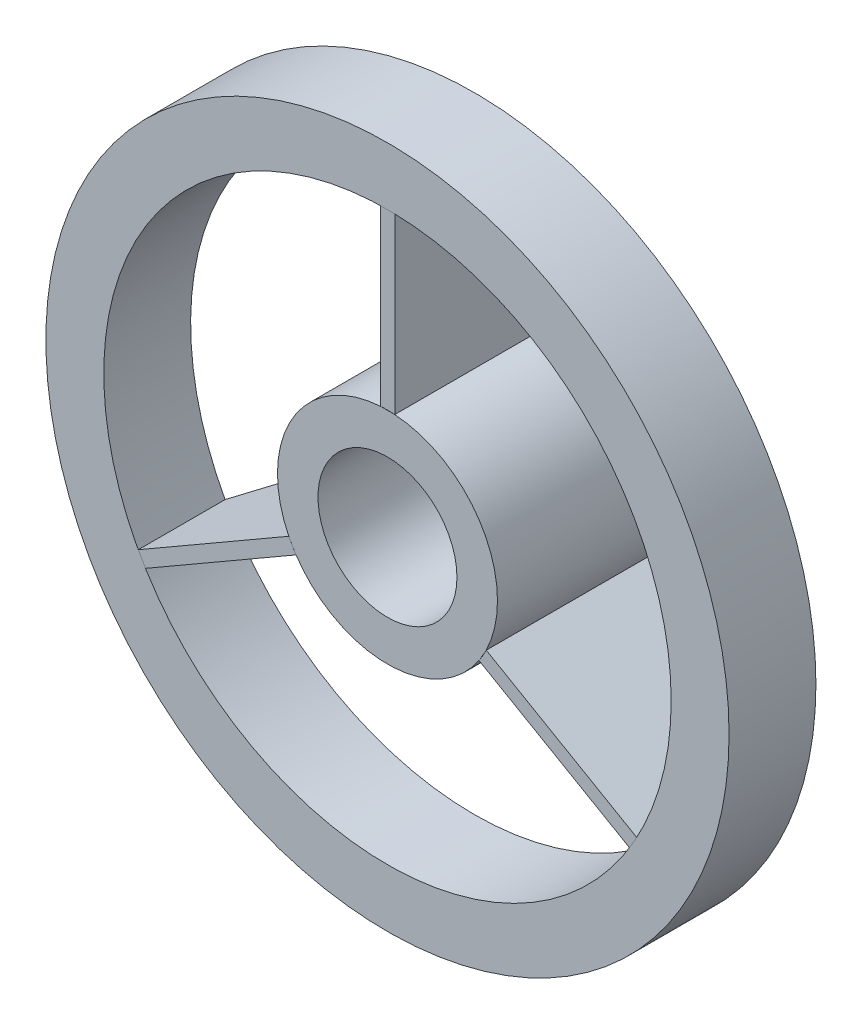
ISO-10303-21;
HEADER;
FILE_DESCRIPTION(('STEP AP214'),'2;1');
FILE_NAME('part.step','',(''),(''),'','','');
FILE_SCHEMA(('AUTOMOTIVE_DESIGN { 1 0 10303 214 1 1 1 1 }'));
ENDSEC;
DATA;
#1=APPLICATION_CONTEXT('core data for automotive mechanical design processes');
#2=APPLICATION_PROTOCOL_DEFINITION('international standard','automotive_design',2000,#1);
#3=PRODUCT_CONTEXT('',#1,'mechanical');
#4=PRODUCT('Part','Part','',(#3));
#5=PRODUCT_RELATED_PRODUCT_CATEGORY('part','',(#4));
#6=PRODUCT_DEFINITION_FORMATION('','',#4);
#7=PRODUCT_DEFINITION_CONTEXT('part definition',#1,'design');
#8=PRODUCT_DEFINITION('design','',#6,#7);
#9=PRODUCT_DEFINITION_SHAPE('','',#8);
#10=(LENGTH_UNIT() NAMED_UNIT(*) SI_UNIT(.MILLI.,.METRE.));
#11=(NAMED_UNIT(*) PLANE_ANGLE_UNIT() SI_UNIT($,.RADIAN.));
#12=(NAMED_UNIT(*) SI_UNIT($,.STERADIAN.) SOLID_ANGLE_UNIT());
#13=UNCERTAINTY_MEASURE_WITH_UNIT(LENGTH_MEASURE(1.E-05),#10,'distance_accuracy_value','');
#14=(GEOMETRIC_REPRESENTATION_CONTEXT(3) GLOBAL_UNCERTAINTY_ASSIGNED_CONTEXT((#13)) GLOBAL_UNIT_ASSIGNED_CONTEXT((#10,
#11,#12)) REPRESENTATION_CONTEXT('',''));
#15=CARTESIAN_POINT('',(0.,0.,0.));
#16=DIRECTION('',(0.,0.,1.));
#17=DIRECTION('',(1.,0.,0.));
#18=AXIS2_PLACEMENT_3D('',#15,#16,#17);
#19=CARTESIAN_POINT('',(0.125,0.,0.));
#20=DIRECTION('',(1.,0.,0.));
#21=DIRECTION('',(0.,0.,-1.));
#22=AXIS2_PLACEMENT_3D('',#19,#20,#21);
#23=PLANE('',#22);
#24=DIRECTION('',(0.,0.83227284039794,0.554366231958572));
#25=VECTOR('',#24,1.);
#26=CARTESIAN_POINT('',(0.125,4.90665903898702,2.00349704059022));
#27=LINE('',#26,#25);
#28=CARTESIAN_POINT('',(0.125,1.89879875354038,0.));
#29=VERTEX_POINT('',#28);
#30=CARTESIAN_POINT('',(0.125,4.90140891418283,2.));
#31=VERTEX_POINT('',#30);
#32=EDGE_CURVE('E326',#29,#31,#27,.T.);
#33=ORIENTED_EDGE('',*,*,#32,.T.);
#34=DIRECTION('',(0.,-1.,0.));
#35=VECTOR('',#34,1.);
#36=CARTESIAN_POINT('',(0.125,0.,2.));
#37=LINE('',#36,#35);
#38=CARTESIAN_POINT('',(0.125,4.89840535276533,2.));
#39=VERTEX_POINT('',#38);
#40=EDGE_CURVE('E317',#31,#39,#37,.T.);
#41=ORIENTED_EDGE('',*,*,#40,.T.);
#42=DIRECTION('',(0.,0.,1.));
#43=VECTOR('',#42,1.);
#44=CARTESIAN_POINT('',(0.125,4.89840535276533,2.));
#45=LINE('',#44,#43);
#46=CARTESIAN_POINT('',(0.125,4.89840535276533,3.49850542576746));
#47=VERTEX_POINT('',#46);
#48=EDGE_CURVE('E311',#39,#47,#45,.T.);
#49=ORIENTED_EDGE('',*,*,#48,.T.);
#50=DIRECTION('',(0.,-1.,0.));
#51=VECTOR('',#50,1.);
#52=CARTESIAN_POINT('',(0.125,1.89879875354038,3.49850542576746));
#53=LINE('',#52,#51);
#54=CARTESIAN_POINT('',(0.125,1.89588369896468,3.49850542576746));
#55=VERTEX_POINT('',#54);
#56=EDGE_CURVE('E321',#47,#55,#53,.T.);
#57=ORIENTED_EDGE('',*,*,#56,.T.);
#58=DIRECTION('',(0.,0.,-1.));
#59=VECTOR('',#58,1.);
#60=CARTESIAN_POINT('',(0.125,1.89588369896468,3.5));
#61=LINE('',#60,#59);
#62=CARTESIAN_POINT('',(0.125,1.89588369896468,0.));
#63=VERTEX_POINT('',#62);
#64=EDGE_CURVE('E459',#63,#55,#61,.F.);
#65=ORIENTED_EDGE('',*,*,#64,.F.);
#66=DIRECTION('',(0.,1.,0.));
#67=VECTOR('',#66,1.);
#68=CARTESIAN_POINT('',(0.125,1.69879875354038,0.));
#69=LINE('',#68,#67);
#70=EDGE_CURVE('E323',#63,#29,#69,.T.);
#71=ORIENTED_EDGE('',*,*,#70,.T.);
#72=EDGE_LOOP('',(#33,#41,#49,#57,#65,#71));
#73=FACE_BOUND('',#72,.T.);
#74=ADVANCED_FACE('F33',(#73),#23,.T.);
#75=CARTESIAN_POINT('',(-0.125,0.,0.));
#76=DIRECTION('',(1.,0.,0.));
#77=DIRECTION('',(0.,0.,-1.));
#78=AXIS2_PLACEMENT_3D('',#75,#76,#77);
#79=PLANE('',#78);
#80=DIRECTION('',(0.,-1.,0.));
#81=VECTOR('',#80,1.);
#82=CARTESIAN_POINT('',(-0.125,0.,2.));
#83=LINE('',#82,#81);
#84=CARTESIAN_POINT('',(-0.125,4.90140891418283,2.));
#85=VERTEX_POINT('',#84);
#86=CARTESIAN_POINT('',(-0.125,4.89840535276533,2.));
#87=VERTEX_POINT('',#86);
#88=EDGE_CURVE('E314',#85,#87,#83,.T.);
#89=ORIENTED_EDGE('',*,*,#88,.F.);
#90=DIRECTION('',(0.,0.83227284039794,0.554366231958572));
#91=VECTOR('',#90,1.);
#92=CARTESIAN_POINT('',(-0.125,4.90665903898702,2.00349704059022));
#93=LINE('',#92,#91);
#94=CARTESIAN_POINT('',(-0.125,1.89879875354038,0.));
#95=VERTEX_POINT('',#94);
#96=EDGE_CURVE('E332',#95,#85,#93,.T.);
#97=ORIENTED_EDGE('',*,*,#96,.F.);
#98=DIRECTION('',(0.,1.,0.));
#99=VECTOR('',#98,1.);
#100=CARTESIAN_POINT('',(-0.125,1.69879875354038,0.));
#101=LINE('',#100,#99);
#102=CARTESIAN_POINT('',(-0.125,1.89588369896468,0.));
#103=VERTEX_POINT('',#102);
#104=EDGE_CURVE('E320',#103,#95,#101,.T.);
#105=ORIENTED_EDGE('',*,*,#104,.F.);
#106=DIRECTION('',(0.,0.,-1.));
#107=VECTOR('',#106,1.);
#108=CARTESIAN_POINT('',(-0.125,1.89588369896468,3.5));
#109=LINE('',#108,#107);
#110=CARTESIAN_POINT('',(-0.125,1.89588369896468,3.49850542576746));
#111=VERTEX_POINT('',#110);
#112=EDGE_CURVE('E447',#103,#111,#109,.F.);
#113=ORIENTED_EDGE('',*,*,#112,.T.);
#114=DIRECTION('',(0.,-1.,0.));
#115=VECTOR('',#114,1.);
#116=CARTESIAN_POINT('',(-0.125,1.89879875354038,3.49850542576746));
#117=LINE('',#116,#115);
#118=CARTESIAN_POINT('',(-0.125,4.89840535276533,3.49850542576746));
#119=VERTEX_POINT('',#118);
#120=EDGE_CURVE('E324',#119,#111,#117,.T.);
#121=ORIENTED_EDGE('',*,*,#120,.F.);
#122=DIRECTION('',(0.,0.,1.));
#123=VECTOR('',#122,1.);
#124=CARTESIAN_POINT('',(-0.125,4.89840535276533,2.));
#125=LINE('',#124,#123);
#126=EDGE_CURVE('E305',#87,#119,#125,.T.);
#127=ORIENTED_EDGE('',*,*,#126,.F.);
#128=EDGE_LOOP('',(#89,#97,#105,#113,#121,#127));
#129=FACE_BOUND('',#128,.T.);
#130=ADVANCED_FACE('F360',(#129),#79,.F.);
#131=CARTESIAN_POINT('',(0.125,4.90665903898702,2.00349704059022));
#132=DIRECTION('',(0.,-0.554366231958572,0.83227284039794));
#133=DIRECTION('',(0.,-0.83227284039794,-0.554366231958572));
#134=AXIS2_PLACEMENT_3D('',#131,#132,#133);
#135=PLANE('',#134);
#136=DIRECTION('',(-1.,0.,0.));
#137=VECTOR('',#136,1.);
#138=CARTESIAN_POINT('',(0.125,4.90140891418283,2.));
#139=LINE('',#138,#137);
#140=EDGE_CURVE('E466',#31,#85,#139,.T.);
#141=ORIENTED_EDGE('',*,*,#140,.F.);
#142=ORIENTED_EDGE('',*,*,#32,.F.);
#143=DIRECTION('',(-1.,0.,0.));
#144=VECTOR('',#143,1.);
#145=CARTESIAN_POINT('',(0.125,1.89879875354038,0.));
#146=LINE('',#145,#144);
#147=CARTESIAN_POINT('',(0.0675521543217856,1.89879875354038,0.));
#148=VERTEX_POINT('',#147);
#149=EDGE_CURVE('E343',#29,#148,#146,.T.);
#150=ORIENTED_EDGE('',*,*,#149,.T.);
#151=CARTESIAN_POINT('',(-0.0675521543217856,1.89879875354038,0.));
#152=DIRECTION('',(1.,0.,0.));
#153=VECTOR('',#152,1.);
#154=LINE('',#151,#153);
#155=CARTESIAN_POINT('',(-0.0675521543217856,1.89879875354038,0.));
#156=VERTEX_POINT('',#155);
#157=EDGE_CURVE('E462',#156,#148,#154,.T.);
#158=ORIENTED_EDGE('',*,*,#157,.F.);
#159=EDGE_CURVE('E329',#156,#95,#146,.T.);
#160=ORIENTED_EDGE('',*,*,#159,.T.);
#161=ORIENTED_EDGE('',*,*,#96,.T.);
#162=EDGE_LOOP('',(#141,#142,#150,#158,#160,#161));
#163=FACE_BOUND('',#162,.T.);
#164=ADVANCED_FACE('F349',(#163),#135,.F.);
#165=CARTESIAN_POINT('',(0.125,1.89879875354038,3.49850542576746));
#166=DIRECTION('',(0.,0.,-1.));
#167=DIRECTION('',(-1.,0.,0.));
#168=AXIS2_PLACEMENT_3D('',#165,#166,#167);
#169=PLANE('',#168);
#170=CARTESIAN_POINT('',(0.,0.,3.49850542576746));
#171=DIRECTION('',(0.,0.,-1.));
#172=DIRECTION('',(-1.,0.,0.));
#173=AXIS2_PLACEMENT_3D('',#170,#171,#172);
#174=CIRCLE('',#173,4.9);
#175=EDGE_CURVE('E465',#119,#47,#174,.T.);
#176=ORIENTED_EDGE('',*,*,#175,.F.);
#177=ORIENTED_EDGE('',*,*,#120,.T.);
#178=CARTESIAN_POINT('',(0.,0.,3.49850542576746));
#179=DIRECTION('',(0.,0.,-1.));
#180=DIRECTION('',(-1.,0.,0.));
#181=AXIS2_PLACEMENT_3D('',#178,#179,#180);
#182=CIRCLE('',#181,1.9);
#183=EDGE_CURVE('E450',#111,#55,#182,.T.);
#184=ORIENTED_EDGE('',*,*,#183,.T.);
#185=ORIENTED_EDGE('',*,*,#56,.F.);
#186=EDGE_LOOP('',(#176,#177,#184,#185));
#187=FACE_BOUND('',#186,.T.);
#188=ADVANCED_FACE('F359',(#187),#169,.F.);
#189=CARTESIAN_POINT('',(0.,0.,3.5));
#190=DIRECTION('',(0.,0.,1.));
#191=DIRECTION('',(1.,0.,0.));
#192=AXIS2_PLACEMENT_3D('',#189,#190,#191);
#193=PLANE('',#192);
#194=CARTESIAN_POINT('',(0.,0.,3.5));
#195=DIRECTION('',(0.,0.,1.));
#196=DIRECTION('',(1.,0.,0.));
#197=AXIS2_PLACEMENT_3D('',#194,#195,#196);
#198=CIRCLE('',#197,1.9);
#199=CARTESIAN_POINT('',(1.9,0.,3.5));
#200=VERTEX_POINT('',#199);
#201=EDGE_CURVE('E445',#200,#200,#198,.T.);
#202=ORIENTED_EDGE('',*,*,#201,.T.);
#203=EDGE_LOOP('',(#202));
#204=FACE_BOUND('',#203,.T.);
#205=CARTESIAN_POINT('',(0.,0.,3.5));
#206=DIRECTION('',(0.,0.,1.));
#207=DIRECTION('',(1.,0.,0.));
#208=AXIS2_PLACEMENT_3D('',#205,#206,#207);
#209=CIRCLE('',#208,1.2);
#210=CARTESIAN_POINT('',(1.2,0.,3.5));
#211=VERTEX_POINT('',#210);
#212=EDGE_CURVE('E439',#211,#211,#209,.T.);
#213=ORIENTED_EDGE('',*,*,#212,.F.);
#214=EDGE_LOOP('',(#213));
#215=FACE_BOUND('',#214,.T.);
#216=ADVANCED_FACE('F368',(#204,#215),#193,.T.);
#217=CARTESIAN_POINT('',(0.,0.,0.));
#218=DIRECTION('',(0.,0.,1.));
#219=DIRECTION('',(1.,0.,0.));
#220=AXIS2_PLACEMENT_3D('',#217,#218,#219);
#221=PLANE('',#220);
#222=DIRECTION('',(-0.866025403784443,-0.499999999999992,0.));
#223=VECTOR('',#222,1.);
#224=CARTESIAN_POINT('',(-1.53370287648331,-0.741146201297119,0.));
#225=LINE('',#224,#223);
#226=CARTESIAN_POINT('',(-1.70438344592423,-0.839688674009269,0.));
#227=VERTEX_POINT('',#226);
#228=CARTESIAN_POINT('',(-1.7069079572402,-0.841146201297117,0.));
#229=VERTEX_POINT('',#228);
#230=EDGE_CURVE('E178',#227,#229,#225,.T.);
#231=ORIENTED_EDGE('',*,*,#230,.F.);
#232=CARTESIAN_POINT('',(0.,0.,0.));
#233=DIRECTION('',(0.,0.,1.));
#234=DIRECTION('',(1.,0.,0.));
#235=AXIS2_PLACEMENT_3D('',#232,#233,#234);
#236=CIRCLE('',#235,1.9);
#237=EDGE_CURVE('E441',#103,#227,#236,.T.);
#238=ORIENTED_EDGE('',*,*,#237,.F.);
#239=ORIENTED_EDGE('',*,*,#104,.T.);
#240=ORIENTED_EDGE('',*,*,#159,.F.);
#241=ORIENTED_EDGE('',*,*,#157,.T.);
#242=ORIENTED_EDGE('',*,*,#149,.F.);
#243=ORIENTED_EDGE('',*,*,#70,.F.);
#244=CARTESIAN_POINT('',(1.70438344592422,-0.839688674009293,0.));
#245=VERTEX_POINT('',#244);
#246=EDGE_CURVE('E434',#245,#63,#236,.T.);
#247=ORIENTED_EDGE('',*,*,#246,.F.);
#248=DIRECTION('',(0.866025403784436,-0.500000000000004,0.));
#249=VECTOR('',#248,1.);
#250=CARTESIAN_POINT('',(1.5337028764833,-0.74114620129714,0.));
#251=LINE('',#250,#249);
#252=CARTESIAN_POINT('',(1.70690795724019,-0.841146201297141,0.));
#253=VERTEX_POINT('',#252);
#254=EDGE_CURVE('E412',#245,#253,#251,.T.);
#255=ORIENTED_EDGE('',*,*,#254,.T.);
#256=DIRECTION('',(0.500000000000004,0.866025403784436,0.));
#257=VECTOR('',#256,1.);
#258=CARTESIAN_POINT('',(1.58190795724019,-1.05765255224325,0.));
#259=LINE('',#258,#257);
#260=CARTESIAN_POINT('',(1.67818403440105,-0.890897495047229,0.));
#261=VERTEX_POINT('',#260);
#262=EDGE_CURVE('E270',#261,#253,#259,.T.);
#263=ORIENTED_EDGE('',*,*,#262,.F.);
#264=CARTESIAN_POINT('',(1.61063188007932,-1.00790125849319,0.));
#265=CARTESIAN_POINT('',(1.6464892352771,-0.950601003205067,0.00160077581914768));
#266=CARTESIAN_POINT('',(1.67818403440106,-0.890897495047202,0.));
#267=B_SPLINE_CURVE_WITH_KNOTS('',2,(#264,#265,#266),.UNSPECIFIED.,.F.,.F.,(3,3),(0.,1.),.UNSPECIFIED.);
#268=CARTESIAN_POINT('',(1.61063188007934,-1.00790125849316,0.));
#269=VERTEX_POINT('',#268);
#270=EDGE_CURVE('E288',#269,#261,#267,.T.);
#271=ORIENTED_EDGE('',*,*,#270,.F.);
#272=CARTESIAN_POINT('',(1.58190795724019,-1.05765255224325,0.));
#273=VERTEX_POINT('',#272);
#274=EDGE_CURVE('E260',#273,#269,#259,.T.);
#275=ORIENTED_EDGE('',*,*,#274,.F.);
#276=DIRECTION('',(0.866025403784436,-0.500000000000004,0.));
#277=VECTOR('',#276,1.);
#278=CARTESIAN_POINT('',(1.4087028764833,-0.95765255224325,0.));
#279=LINE('',#278,#277);
#280=CARTESIAN_POINT('',(1.57938344592422,-1.0561950249554,0.));
#281=VERTEX_POINT('',#280);
#282=EDGE_CURVE('E424',#281,#273,#279,.T.);
#283=ORIENTED_EDGE('',*,*,#282,.F.);
#284=CARTESIAN_POINT('',(-1.57938344592423,-1.05619502495538,0.));
#285=VERTEX_POINT('',#284);
#286=EDGE_CURVE('E438',#285,#281,#236,.T.);
#287=ORIENTED_EDGE('',*,*,#286,.F.);
#288=DIRECTION('',(-0.866025403784443,-0.499999999999992,0.));
#289=VECTOR('',#288,1.);
#290=CARTESIAN_POINT('',(-1.40870287648331,-0.95765255224323,0.));
#291=LINE('',#290,#289);
#292=CARTESIAN_POINT('',(-1.5819079572402,-1.05765255224323,0.));
#293=VERTEX_POINT('',#292);
#294=EDGE_CURVE('E205',#285,#293,#291,.T.);
#295=ORIENTED_EDGE('',*,*,#294,.T.);
#296=DIRECTION('',(0.499999999999992,-0.866025403784443,0.));
#297=VECTOR('',#296,1.);
#298=CARTESIAN_POINT('',(-1.7069079572402,-0.841146201297117,0.));
#299=LINE('',#298,#297);
#300=CARTESIAN_POINT('',(-1.61063188007935,-1.00790125849315,0.));
#301=VERTEX_POINT('',#300);
#302=EDGE_CURVE('E197',#301,#293,#299,.T.);
#303=ORIENTED_EDGE('',*,*,#302,.F.);
#304=CARTESIAN_POINT('',(-1.67818403440108,-0.890897495047158,0.));
#305=CARTESIAN_POINT('',(-1.64648923527712,-0.950601003205046,0.00160077581914898));
#306=CARTESIAN_POINT('',(-1.61063188007932,-1.00790125849319,0.));
#307=B_SPLINE_CURVE_WITH_KNOTS('',2,(#304,#305,#306),.UNSPECIFIED.,.F.,.F.,(3,3),(0.,1.),.UNSPECIFIED.);
#308=CARTESIAN_POINT('',(-1.67818403440106,-0.890897495047201,0.));
#309=VERTEX_POINT('',#308);
#310=EDGE_CURVE('E194',#309,#301,#307,.T.);
#311=ORIENTED_EDGE('',*,*,#310,.F.);
#312=EDGE_CURVE('E190',#229,#309,#299,.T.);
#313=ORIENTED_EDGE('',*,*,#312,.F.);
#314=EDGE_LOOP('',(#231,#238,#239,#240,#241,#242,#243,#247,#255,#263,#271,#275,#283,#287,#295,
#303,#311,#313));
#315=FACE_BOUND('',#314,.T.);
#316=CARTESIAN_POINT('',(0.,0.,0.));
#317=DIRECTION('',(0.,0.,1.));
#318=DIRECTION('',(1.,0.,0.));
#319=AXIS2_PLACEMENT_3D('',#316,#317,#318);
#320=CIRCLE('',#319,1.2);
#321=CARTESIAN_POINT('',(1.2,0.,0.));
#322=VERTEX_POINT('',#321);
#323=EDGE_CURVE('E345',#322,#322,#320,.T.);
#324=ORIENTED_EDGE('',*,*,#323,.T.);
#325=EDGE_LOOP('',(#324));
#326=FACE_BOUND('',#325,.T.);
#327=ADVANCED_FACE('F191',(#315,#326),#221,.F.);
#328=CARTESIAN_POINT('',(0.,0.,3.5));
#329=DIRECTION('',(0.,0.,-1.));
#330=DIRECTION('',(-1.,0.,0.));
#331=AXIS2_PLACEMENT_3D('',#328,#329,#330);
#332=CYLINDRICAL_SURFACE('',#331,1.9);
#333=ORIENTED_EDGE('',*,*,#201,.F.);
#334=EDGE_LOOP('',(#333));
#335=FACE_BOUND('',#334,.T.);
#336=ORIENTED_EDGE('',*,*,#237,.T.);
#337=DIRECTION('',(0.,0.,-1.));
#338=VECTOR('',#337,1.);
#339=CARTESIAN_POINT('',(-1.70438344592423,-0.839688674009269,3.5));
#340=LINE('',#339,#338);
#341=CARTESIAN_POINT('',(-1.70438344592423,-0.83968867400927,3.49850542576746));
#342=VERTEX_POINT('',#341);
#343=EDGE_CURVE('E51',#227,#342,#340,.F.);
#344=ORIENTED_EDGE('',*,*,#343,.T.);
#345=CARTESIAN_POINT('',(0.,0.,3.49850542576746));
#346=DIRECTION('',(0.,0.,-1.));
#347=DIRECTION('',(-1.,0.,0.));
#348=AXIS2_PLACEMENT_3D('',#345,#346,#347);
#349=CIRCLE('',#348,1.9);
#350=CARTESIAN_POINT('',(-1.57938344592423,-1.05619502495538,3.49850542576746));
#351=VERTEX_POINT('',#350);
#352=EDGE_CURVE('E409',#351,#342,#349,.T.);
#353=ORIENTED_EDGE('',*,*,#352,.F.);
#354=DIRECTION('',(0.,0.,-1.));
#355=VECTOR('',#354,1.);
#356=CARTESIAN_POINT('',(-1.57938344592423,-1.05619502495538,3.5));
#357=LINE('',#356,#355);
#358=EDGE_CURVE('E57',#285,#351,#357,.F.);
#359=ORIENTED_EDGE('',*,*,#358,.F.);
#360=ORIENTED_EDGE('',*,*,#286,.T.);
#361=DIRECTION('',(0.,0.,-1.));
#362=VECTOR('',#361,1.);
#363=CARTESIAN_POINT('',(1.57938344592422,-1.0561950249554,3.5));
#364=LINE('',#363,#362);
#365=CARTESIAN_POINT('',(1.57938344592422,-1.0561950249554,3.49850542576746));
#366=VERTEX_POINT('',#365);
#367=EDGE_CURVE('E285',#281,#366,#364,.F.);
#368=ORIENTED_EDGE('',*,*,#367,.T.);
#369=CARTESIAN_POINT('',(0.,0.,3.49850542576746));
#370=DIRECTION('',(0.,0.,-1.));
#371=DIRECTION('',(-1.,0.,0.));
#372=AXIS2_PLACEMENT_3D('',#369,#370,#371);
#373=CIRCLE('',#372,1.9);
#374=CARTESIAN_POINT('',(1.70438344592422,-0.839688674009294,3.49850542576746));
#375=VERTEX_POINT('',#374);
#376=EDGE_CURVE('E286',#375,#366,#373,.T.);
#377=ORIENTED_EDGE('',*,*,#376,.F.);
#378=DIRECTION('',(0.,0.,-1.));
#379=VECTOR('',#378,1.);
#380=CARTESIAN_POINT('',(1.70438344592422,-0.839688674009293,3.5));
#381=LINE('',#380,#379);
#382=EDGE_CURVE('E280',#245,#375,#381,.F.);
#383=ORIENTED_EDGE('',*,*,#382,.F.);
#384=ORIENTED_EDGE('',*,*,#246,.T.);
#385=ORIENTED_EDGE('',*,*,#64,.T.);
#386=ORIENTED_EDGE('',*,*,#183,.F.);
#387=ORIENTED_EDGE('',*,*,#112,.F.);
#388=EDGE_LOOP('',(#336,#344,#353,#359,#360,#368,#377,#383,#384,#385,#386,#387));
#389=FACE_BOUND('',#388,.T.);
#390=ADVANCED_FACE('F35',(#335,#389),#332,.T.);
#391=CARTESIAN_POINT('',(0.,0.,3.5));
#392=DIRECTION('',(0.,0.,-1.));
#393=DIRECTION('',(-1.,0.,0.));
#394=AXIS2_PLACEMENT_3D('',#391,#392,#393);
#395=CYLINDRICAL_SURFACE('',#394,1.2);
#396=ORIENTED_EDGE('',*,*,#212,.T.);
#397=EDGE_LOOP('',(#396));
#398=FACE_BOUND('',#397,.T.);
#399=ORIENTED_EDGE('',*,*,#323,.F.);
#400=EDGE_LOOP('',(#399));
#401=FACE_BOUND('',#400,.T.);
#402=ADVANCED_FACE('F363',(#398,#401),#395,.F.);
#403=CARTESIAN_POINT('',(0.,0.,2.));
#404=DIRECTION('',(0.,0.,1.));
#405=DIRECTION('',(1.,0.,0.));
#406=AXIS2_PLACEMENT_3D('',#403,#404,#405);
#407=CYLINDRICAL_SURFACE('',#406,5.9);
#408=CARTESIAN_POINT('',(0.,0.,2.));
#409=DIRECTION('',(0.,0.,1.));
#410=DIRECTION('',(1.,0.,0.));
#411=AXIS2_PLACEMENT_3D('',#408,#409,#410);
#412=CIRCLE('',#411,5.9);
#413=CARTESIAN_POINT('',(5.9,0.,2.));
#414=VERTEX_POINT('',#413);
#415=EDGE_CURVE('E302',#414,#414,#412,.T.);
#416=ORIENTED_EDGE('',*,*,#415,.T.);
#417=EDGE_LOOP('',(#416));
#418=FACE_BOUND('',#417,.T.);
#419=CARTESIAN_POINT('',(0.,0.,3.5));
#420=DIRECTION('',(0.,0.,1.));
#421=DIRECTION('',(1.,0.,0.));
#422=AXIS2_PLACEMENT_3D('',#419,#420,#421);
#423=CIRCLE('',#422,5.9);
#424=CARTESIAN_POINT('',(5.9,0.,3.5));
#425=VERTEX_POINT('',#424);
#426=EDGE_CURVE('E306',#425,#425,#423,.T.);
#427=ORIENTED_EDGE('',*,*,#426,.F.);
#428=EDGE_LOOP('',(#427));
#429=FACE_BOUND('',#428,.T.);
#430=ADVANCED_FACE('F366',(#418,#429),#407,.T.);
#431=CARTESIAN_POINT('',(0.,0.,2.));
#432=DIRECTION('',(0.,0.,1.));
#433=DIRECTION('',(1.,0.,0.));
#434=AXIS2_PLACEMENT_3D('',#431,#432,#433);
#435=PLANE('',#434);
#436=CARTESIAN_POINT('',(0.,0.,2.));
#437=DIRECTION('',(0.,0.,1.));
#438=DIRECTION('',(1.,0.,0.));
#439=AXIS2_PLACEMENT_3D('',#436,#437,#438);
#440=CIRCLE('',#439,4.9);
#441=CARTESIAN_POINT('',(-4.30464347352847,-2.34094950090957,2.));
#442=VERTEX_POINT('',#441);
#443=EDGE_CURVE('E300',#87,#442,#440,.T.);
#444=ORIENTED_EDGE('',*,*,#443,.T.);
#445=DIRECTION('',(-0.866025403784443,-0.499999999999992,0.));
#446=VECTOR('',#445,1.);
#447=CARTESIAN_POINT('',(-0.062499999999999,0.108253175473055,2.));
#448=LINE('',#447,#446);
#449=CARTESIAN_POINT('',(-4.30724463401786,-2.34245128161832,2.));
#450=VERTEX_POINT('',#449);
#451=EDGE_CURVE('E406',#442,#450,#448,.T.);
#452=ORIENTED_EDGE('',*,*,#451,.T.);
#453=DIRECTION('',(-0.499999999999992,0.866025403784443,0.));
#454=VECTOR('',#453,1.);
#455=CARTESIAN_POINT('',(-4.24474463401786,-2.45070445709138,2.));
#456=LINE('',#455,#454);
#457=CARTESIAN_POINT('',(-4.18224463401786,-2.55895763256443,2.));
#458=VERTEX_POINT('',#457);
#459=EDGE_CURVE('E11',#458,#450,#456,.T.);
#460=ORIENTED_EDGE('',*,*,#459,.F.);
#461=DIRECTION('',(-0.866025403784443,-0.499999999999992,0.));
#462=VECTOR('',#461,1.);
#463=CARTESIAN_POINT('',(0.062499999999999,-0.108253175473055,2.));
#464=LINE('',#463,#462);
#465=CARTESIAN_POINT('',(-4.17964347352847,-2.55745585185568,2.));
#466=VERTEX_POINT('',#465);
#467=EDGE_CURVE('E196',#466,#458,#464,.T.);
#468=ORIENTED_EDGE('',*,*,#467,.F.);
#469=CARTESIAN_POINT('',(4.17964347352844,-2.55745585185574,2.));
#470=VERTEX_POINT('',#469);
#471=EDGE_CURVE('E299',#466,#470,#440,.T.);
#472=ORIENTED_EDGE('',*,*,#471,.T.);
#473=DIRECTION('',(0.866025403784436,-0.500000000000004,0.));
#474=VECTOR('',#473,1.);
#475=CARTESIAN_POINT('',(-0.0625000000000005,-0.108253175473055,2.));
#476=LINE('',#475,#474);
#477=CARTESIAN_POINT('',(4.18224463401782,-2.55895763256449,2.));
#478=VERTEX_POINT('',#477);
#479=EDGE_CURVE('E283',#470,#478,#476,.T.);
#480=ORIENTED_EDGE('',*,*,#479,.T.);
#481=DIRECTION('',(-0.500000000000004,-0.866025403784436,0.));
#482=VECTOR('',#481,1.);
#483=CARTESIAN_POINT('',(4.24474463401782,-2.45070445709144,2.));
#484=LINE('',#483,#482);
#485=CARTESIAN_POINT('',(4.30724463401782,-2.34245128161838,2.));
#486=VERTEX_POINT('',#485);
#487=EDGE_CURVE('E395',#486,#478,#484,.T.);
#488=ORIENTED_EDGE('',*,*,#487,.F.);
#489=DIRECTION('',(0.866025403784436,-0.500000000000004,0.));
#490=VECTOR('',#489,1.);
#491=CARTESIAN_POINT('',(0.0625000000000005,0.108253175473055,2.));
#492=LINE('',#491,#490);
#493=CARTESIAN_POINT('',(4.30464347352844,-2.34094950090963,2.));
#494=VERTEX_POINT('',#493);
#495=EDGE_CURVE('E269',#494,#486,#492,.T.);
#496=ORIENTED_EDGE('',*,*,#495,.F.);
#497=EDGE_CURVE('E295',#494,#39,#440,.T.);
#498=ORIENTED_EDGE('',*,*,#497,.T.);
#499=ORIENTED_EDGE('',*,*,#40,.F.);
#500=ORIENTED_EDGE('',*,*,#140,.T.);
#501=ORIENTED_EDGE('',*,*,#88,.T.);
#502=EDGE_LOOP('',(#444,#452,#460,#468,#472,#480,#488,#496,#498,#499,#500,#501));
#503=FACE_BOUND('',#502,.T.);
#504=ORIENTED_EDGE('',*,*,#415,.F.);
#505=EDGE_LOOP('',(#504));
#506=FACE_BOUND('',#505,.T.);
#507=ADVANCED_FACE('F404',(#503,#506),#435,.F.);
#508=CARTESIAN_POINT('',(0.,0.,3.5));
#509=DIRECTION('',(0.,0.,1.));
#510=DIRECTION('',(1.,0.,0.));
#511=AXIS2_PLACEMENT_3D('',#508,#509,#510);
#512=PLANE('',#511);
#513=CARTESIAN_POINT('',(0.,0.,3.5));
#514=DIRECTION('',(0.,0.,1.));
#515=DIRECTION('',(1.,0.,0.));
#516=AXIS2_PLACEMENT_3D('',#513,#514,#515);
#517=CIRCLE('',#516,4.9);
#518=CARTESIAN_POINT('',(4.9,0.,3.5));
#519=VERTEX_POINT('',#518);
#520=EDGE_CURVE('E292',#519,#519,#517,.T.);
#521=ORIENTED_EDGE('',*,*,#520,.F.);
#522=EDGE_LOOP('',(#521));
#523=FACE_BOUND('',#522,.T.);
#524=ORIENTED_EDGE('',*,*,#426,.T.);
#525=EDGE_LOOP('',(#524));
#526=FACE_BOUND('',#525,.T.);
#527=ADVANCED_FACE('F484',(#523,#526),#512,.T.);
#528=CARTESIAN_POINT('',(0.,0.,2.));
#529=DIRECTION('',(0.,0.,1.));
#530=DIRECTION('',(1.,0.,0.));
#531=AXIS2_PLACEMENT_3D('',#528,#529,#530);
#532=CYLINDRICAL_SURFACE('',#531,4.9);
#533=CARTESIAN_POINT('',(0.,0.,3.49850542576746));
#534=DIRECTION('',(0.,0.,-1.));
#535=DIRECTION('',(-1.,0.,0.));
#536=AXIS2_PLACEMENT_3D('',#533,#534,#535);
#537=CIRCLE('',#536,4.9);
#538=CARTESIAN_POINT('',(-4.30464347352847,-2.34094950090957,3.49850542576746));
#539=VERTEX_POINT('',#538);
#540=CARTESIAN_POINT('',(-4.17964347352847,-2.55745585185568,3.49850542576746));
#541=VERTEX_POINT('',#540);
#542=EDGE_CURVE('E394',#539,#541,#537,.F.);
#543=ORIENTED_EDGE('',*,*,#542,.F.);
#544=DIRECTION('',(0.,0.,1.));
#545=VECTOR('',#544,1.);
#546=CARTESIAN_POINT('',(-4.30464347352847,-2.34094950090957,2.));
#547=LINE('',#546,#545);
#548=EDGE_CURVE('E43',#539,#442,#547,.F.);
#549=ORIENTED_EDGE('',*,*,#548,.T.);
#550=ORIENTED_EDGE('',*,*,#443,.F.);
#551=ORIENTED_EDGE('',*,*,#126,.T.);
#552=ORIENTED_EDGE('',*,*,#175,.T.);
#553=ORIENTED_EDGE('',*,*,#48,.F.);
#554=ORIENTED_EDGE('',*,*,#497,.F.);
#555=DIRECTION('',(0.,0.,1.));
#556=VECTOR('',#555,1.);
#557=CARTESIAN_POINT('',(4.30464347352844,-2.34094950090963,2.));
#558=LINE('',#557,#556);
#559=CARTESIAN_POINT('',(4.30464347352844,-2.34094950090963,3.49850542576746));
#560=VERTEX_POINT('',#559);
#561=EDGE_CURVE('E432',#560,#494,#558,.F.);
#562=ORIENTED_EDGE('',*,*,#561,.F.);
#563=CARTESIAN_POINT('',(0.,0.,3.49850542576746));
#564=DIRECTION('',(0.,0.,-1.));
#565=DIRECTION('',(-1.,0.,0.));
#566=AXIS2_PLACEMENT_3D('',#563,#564,#565);
#567=CIRCLE('',#566,4.9);
#568=CARTESIAN_POINT('',(4.17964347352844,-2.55745585185574,3.49850542576746));
#569=VERTEX_POINT('',#568);
#570=EDGE_CURVE('E430',#569,#560,#567,.F.);
#571=ORIENTED_EDGE('',*,*,#570,.F.);
#572=DIRECTION('',(0.,0.,1.));
#573=VECTOR('',#572,1.);
#574=CARTESIAN_POINT('',(4.17964347352844,-2.55745585185574,2.));
#575=LINE('',#574,#573);
#576=EDGE_CURVE('E640',#569,#470,#575,.F.);
#577=ORIENTED_EDGE('',*,*,#576,.T.);
#578=ORIENTED_EDGE('',*,*,#471,.F.);
#579=DIRECTION('',(0.,0.,1.));
#580=VECTOR('',#579,1.);
#581=CARTESIAN_POINT('',(-4.17964347352847,-2.55745585185568,2.));
#582=LINE('',#581,#580);
#583=EDGE_CURVE('E386',#541,#466,#582,.F.);
#584=ORIENTED_EDGE('',*,*,#583,.F.);
#585=EDGE_LOOP('',(#543,#549,#550,#551,#552,#553,#554,#562,#571,#577,#578,#584));
#586=FACE_BOUND('',#585,.T.);
#587=ORIENTED_EDGE('',*,*,#520,.T.);
#588=EDGE_LOOP('',(#587));
#589=FACE_BOUND('',#588,.T.);
#590=ADVANCED_FACE('F251',(#586,#589),#532,.F.);
#591=CARTESIAN_POINT('',(4.18679137547129,-2.56158269496658,2.00349704059022));
#592=DIRECTION('',(-0.480095239876379,0.277183115979288,0.83227284039794));
#593=DIRECTION('',(0.866213591669528,0.,0.499673907270507));
#594=AXIS2_PLACEMENT_3D('',#591,#592,#593);
#595=PLANE('',#594);
#596=ORIENTED_EDGE('',*,*,#274,.T.);
#597=ORIENTED_EDGE('',*,*,#270,.T.);
#598=ORIENTED_EDGE('',*,*,#262,.T.);
#599=DIRECTION('',(0.720769422664446,-0.416136420198973,0.554366231958572));
#600=VECTOR('',#599,1.);
#601=CARTESIAN_POINT('',(4.31179137547129,-2.34507634402047,2.00349704059022));
#602=LINE('',#601,#600);
#603=EDGE_CURVE('E414',#253,#486,#602,.T.);
#604=ORIENTED_EDGE('',*,*,#603,.T.);
#605=ORIENTED_EDGE('',*,*,#487,.T.);
#606=DIRECTION('',(0.720769422664446,-0.416136420198973,0.554366231958572));
#607=VECTOR('',#606,1.);
#608=CARTESIAN_POINT('',(4.18679137547129,-2.56158269496658,2.00349704059022));
#609=LINE('',#608,#607);
#610=EDGE_CURVE('E421',#273,#478,#609,.T.);
#611=ORIENTED_EDGE('',*,*,#610,.F.);
#612=EDGE_LOOP('',(#596,#597,#598,#604,#605,#611));
#613=FACE_BOUND('',#612,.T.);
#614=ADVANCED_FACE('F246',(#613),#595,.F.);
#615=CARTESIAN_POINT('',(1.58190795724019,-1.05765255224325,3.49850542576746));
#616=DIRECTION('',(0.,0.,-1.));
#617=DIRECTION('',(-1.,0.,0.));
#618=AXIS2_PLACEMENT_3D('',#615,#616,#617);
#619=PLANE('',#618);
#620=DIRECTION('',(-0.866025403784436,0.500000000000004,0.));
#621=VECTOR('',#620,1.);
#622=CARTESIAN_POINT('',(1.70690795724019,-0.841146201297141,3.49850542576746));
#623=LINE('',#622,#621);
#624=EDGE_CURVE('E275',#560,#375,#623,.T.);
#625=ORIENTED_EDGE('',*,*,#624,.T.);
#626=ORIENTED_EDGE('',*,*,#376,.T.);
#627=DIRECTION('',(-0.866025403784436,0.500000000000004,0.));
#628=VECTOR('',#627,1.);
#629=CARTESIAN_POINT('',(1.58190795724019,-1.05765255224325,3.49850542576746));
#630=LINE('',#629,#628);
#631=EDGE_CURVE('E425',#569,#366,#630,.T.);
#632=ORIENTED_EDGE('',*,*,#631,.F.);
#633=ORIENTED_EDGE('',*,*,#570,.T.);
#634=EDGE_LOOP('',(#625,#626,#632,#633));
#635=FACE_BOUND('',#634,.T.);
#636=ADVANCED_FACE('F239',(#635),#619,.F.);
#637=CARTESIAN_POINT('',(-0.0625000000000005,-0.108253175473055,0.));
#638=DIRECTION('',(-0.500000000000004,-0.866025403784436,0.));
#639=DIRECTION('',(0.,0.,-1.));
#640=AXIS2_PLACEMENT_3D('',#637,#638,#639);
#641=PLANE('',#640);
#642=ORIENTED_EDGE('',*,*,#367,.F.);
#643=ORIENTED_EDGE('',*,*,#282,.T.);
#644=ORIENTED_EDGE('',*,*,#610,.T.);
#645=ORIENTED_EDGE('',*,*,#479,.F.);
#646=ORIENTED_EDGE('',*,*,#576,.F.);
#647=ORIENTED_EDGE('',*,*,#631,.T.);
#648=EDGE_LOOP('',(#642,#643,#644,#645,#646,#647));
#649=FACE_BOUND('',#648,.T.);
#650=ADVANCED_FACE('F236',(#649),#641,.T.);
#651=CARTESIAN_POINT('',(0.0625000000000005,0.108253175473055,0.));
#652=DIRECTION('',(-0.500000000000004,-0.866025403784436,0.));
#653=DIRECTION('',(0.,0.,-1.));
#654=AXIS2_PLACEMENT_3D('',#651,#652,#653);
#655=PLANE('',#654);
#656=ORIENTED_EDGE('',*,*,#254,.F.);
#657=ORIENTED_EDGE('',*,*,#382,.T.);
#658=ORIENTED_EDGE('',*,*,#624,.F.);
#659=ORIENTED_EDGE('',*,*,#561,.T.);
#660=ORIENTED_EDGE('',*,*,#495,.T.);
#661=ORIENTED_EDGE('',*,*,#603,.F.);
#662=EDGE_LOOP('',(#656,#657,#658,#659,#660,#661));
#663=FACE_BOUND('',#662,.T.);
#664=ADVANCED_FACE('F234',(#663),#655,.F.);
#665=CARTESIAN_POINT('',(-4.31179137547132,-2.34507634402041,2.00349704059022));
#666=DIRECTION('',(0.480095239876383,0.277183115979282,0.83227284039794));
#667=DIRECTION('',(0.866213591669527,0.,-0.49967390727051));
#668=AXIS2_PLACEMENT_3D('',#665,#666,#667);
#669=PLANE('',#668);
#670=ORIENTED_EDGE('',*,*,#312,.T.);
#671=ORIENTED_EDGE('',*,*,#310,.T.);
#672=ORIENTED_EDGE('',*,*,#302,.T.);
#673=DIRECTION('',(-0.720769422664451,-0.416136420198963,0.554366231958572));
#674=VECTOR('',#673,1.);
#675=CARTESIAN_POINT('',(-4.18679137547132,-2.56158269496652,2.00349704059022));
#676=LINE('',#675,#674);
#677=EDGE_CURVE('E208',#293,#458,#676,.T.);
#678=ORIENTED_EDGE('',*,*,#677,.T.);
#679=ORIENTED_EDGE('',*,*,#459,.T.);
#680=DIRECTION('',(-0.720769422664451,-0.416136420198963,0.554366231958572));
#681=VECTOR('',#680,1.);
#682=CARTESIAN_POINT('',(-4.31179137547132,-2.34507634402041,2.00349704059022));
#683=LINE('',#682,#681);
#684=EDGE_CURVE('E183',#229,#450,#683,.T.);
#685=ORIENTED_EDGE('',*,*,#684,.F.);
#686=EDGE_LOOP('',(#670,#671,#672,#678,#679,#685));
#687=FACE_BOUND('',#686,.T.);
#688=ADVANCED_FACE('F199',(#687),#669,.F.);
#689=CARTESIAN_POINT('',(-1.7069079572402,-0.841146201297117,3.49850542576746));
#690=DIRECTION('',(0.,0.,-1.));
#691=DIRECTION('',(-1.,0.,0.));
#692=AXIS2_PLACEMENT_3D('',#689,#690,#691);
#693=PLANE('',#692);
#694=DIRECTION('',(0.866025403784443,0.499999999999992,0.));
#695=VECTOR('',#694,1.);
#696=CARTESIAN_POINT('',(-1.5819079572402,-1.05765255224323,3.49850542576746));
#697=LINE('',#696,#695);
#698=EDGE_CURVE('E210',#541,#351,#697,.T.);
#699=ORIENTED_EDGE('',*,*,#698,.T.);
#700=ORIENTED_EDGE('',*,*,#352,.T.);
#701=DIRECTION('',(0.866025403784443,0.499999999999992,0.));
#702=VECTOR('',#701,1.);
#703=CARTESIAN_POINT('',(-1.7069079572402,-0.841146201297117,3.49850542576746));
#704=LINE('',#703,#702);
#705=EDGE_CURVE('E187',#539,#342,#704,.T.);
#706=ORIENTED_EDGE('',*,*,#705,.F.);
#707=ORIENTED_EDGE('',*,*,#542,.T.);
#708=EDGE_LOOP('',(#699,#700,#706,#707));
#709=FACE_BOUND('',#708,.T.);
#710=ADVANCED_FACE('F233',(#709),#693,.F.);
#711=CARTESIAN_POINT('',(-0.062499999999999,0.108253175473055,0.));
#712=DIRECTION('',(-0.499999999999992,0.866025403784443,0.));
#713=DIRECTION('',(0.,0.,-1.));
#714=AXIS2_PLACEMENT_3D('',#711,#712,#713);
#715=PLANE('',#714);
#716=ORIENTED_EDGE('',*,*,#343,.F.);
#717=ORIENTED_EDGE('',*,*,#230,.T.);
#718=ORIENTED_EDGE('',*,*,#684,.T.);
#719=ORIENTED_EDGE('',*,*,#451,.F.);
#720=ORIENTED_EDGE('',*,*,#548,.F.);
#721=ORIENTED_EDGE('',*,*,#705,.T.);
#722=EDGE_LOOP('',(#716,#717,#718,#719,#720,#721));
#723=FACE_BOUND('',#722,.T.);
#724=ADVANCED_FACE('F180',(#723),#715,.T.);
#725=CARTESIAN_POINT('',(0.062499999999999,-0.108253175473055,0.));
#726=DIRECTION('',(-0.499999999999992,0.866025403784443,0.));
#727=DIRECTION('',(0.,0.,-1.));
#728=AXIS2_PLACEMENT_3D('',#725,#726,#727);
#729=PLANE('',#728);
#730=ORIENTED_EDGE('',*,*,#294,.F.);
#731=ORIENTED_EDGE('',*,*,#358,.T.);
#732=ORIENTED_EDGE('',*,*,#698,.F.);
#733=ORIENTED_EDGE('',*,*,#583,.T.);
#734=ORIENTED_EDGE('',*,*,#467,.T.);
#735=ORIENTED_EDGE('',*,*,#677,.F.);
#736=EDGE_LOOP('',(#730,#731,#732,#733,#734,#735));
#737=FACE_BOUND('',#736,.T.);
#738=ADVANCED_FACE('F534',(#737),#729,.F.);
#739=CLOSED_SHELL('',(#74,#130,#164,#188,#216,#327,#390,#402,#430,#507,#527,#590,#614,#636,#650,
#664,#688,#710,#724,#738));
#740=MANIFOLD_SOLID_BREP('B2',#739);
#741=ADVANCED_BREP_SHAPE_REPRESENTATION('',(#18,#740),#14);
#742=SHAPE_DEFINITION_REPRESENTATION(#9,#741);
ENDSEC;
END-ISO-10303-21;
